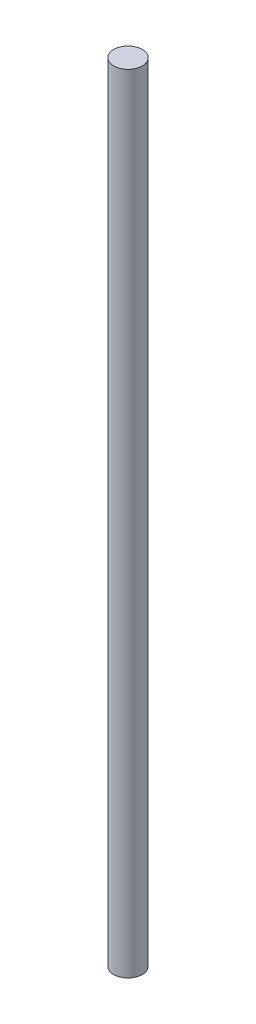
ISO-10303-21;
HEADER;
FILE_DESCRIPTION(('STEP AP214'),'2;1');
FILE_NAME('part.step','',(''),(''),'','','');
FILE_SCHEMA(('AUTOMOTIVE_DESIGN { 1 0 10303 214 1 1 1 1 }'));
ENDSEC;
DATA;
#1=APPLICATION_CONTEXT('core data for automotive mechanical design processes');
#2=APPLICATION_PROTOCOL_DEFINITION('international standard','automotive_design',2000,#1);
#3=PRODUCT_CONTEXT('',#1,'mechanical');
#4=PRODUCT('Part','Part','',(#3));
#5=PRODUCT_RELATED_PRODUCT_CATEGORY('part','',(#4));
#6=PRODUCT_DEFINITION_FORMATION('','',#4);
#7=PRODUCT_DEFINITION_CONTEXT('part definition',#1,'design');
#8=PRODUCT_DEFINITION('design','',#6,#7);
#9=PRODUCT_DEFINITION_SHAPE('','',#8);
#10=(LENGTH_UNIT() NAMED_UNIT(*) SI_UNIT(.MILLI.,.METRE.));
#11=(NAMED_UNIT(*) PLANE_ANGLE_UNIT() SI_UNIT($,.RADIAN.));
#12=(NAMED_UNIT(*) SI_UNIT($,.STERADIAN.) SOLID_ANGLE_UNIT());
#13=UNCERTAINTY_MEASURE_WITH_UNIT(LENGTH_MEASURE(1.E-05),#10,'distance_accuracy_value','');
#14=(GEOMETRIC_REPRESENTATION_CONTEXT(3) GLOBAL_UNCERTAINTY_ASSIGNED_CONTEXT((#13)) GLOBAL_UNIT_ASSIGNED_CONTEXT((#10,
#11,#12)) REPRESENTATION_CONTEXT('',''));
#15=CARTESIAN_POINT('',(0.,0.,0.));
#16=DIRECTION('',(0.,0.,1.));
#17=DIRECTION('',(1.,0.,0.));
#18=AXIS2_PLACEMENT_3D('',#15,#16,#17);
#19=CARTESIAN_POINT('',(0.,220.,0.));
#20=DIRECTION('',(0.,-1.,0.));
#21=DIRECTION('',(0.,0.,-1.));
#22=AXIS2_PLACEMENT_3D('',#19,#20,#21);
#23=CYLINDRICAL_SURFACE('',#22,4.);
#24=CARTESIAN_POINT('',(0.,220.,0.));
#25=DIRECTION('',(0.,1.,0.));
#26=DIRECTION('',(0.,0.,1.));
#27=AXIS2_PLACEMENT_3D('',#24,#25,#26);
#28=CIRCLE('',#27,4.);
#29=CARTESIAN_POINT('',(0.,220.,4.));
#30=VERTEX_POINT('',#29);
#31=EDGE_CURVE('E10',#30,#30,#28,.T.);
#32=ORIENTED_EDGE('',*,*,#31,.F.);
#33=EDGE_LOOP('',(#32));
#34=FACE_BOUND('',#33,.T.);
#35=CARTESIAN_POINT('',(0.,0.,0.));
#36=DIRECTION('',(0.,1.,0.));
#37=DIRECTION('',(0.,0.,1.));
#38=AXIS2_PLACEMENT_3D('',#35,#36,#37);
#39=CIRCLE('',#38,4.);
#40=CARTESIAN_POINT('',(0.,0.,4.));
#41=VERTEX_POINT('',#40);
#42=EDGE_CURVE('E33',#41,#41,#39,.T.);
#43=ORIENTED_EDGE('',*,*,#42,.T.);
#44=EDGE_LOOP('',(#43));
#45=FACE_BOUND('',#44,.T.);
#46=ADVANCED_FACE('F30',(#34,#45),#23,.T.);
#47=CARTESIAN_POINT('',(0.,220.,0.));
#48=DIRECTION('',(0.,1.,0.));
#49=DIRECTION('',(0.,0.,1.));
#50=AXIS2_PLACEMENT_3D('',#47,#48,#49);
#51=PLANE('',#50);
#52=ORIENTED_EDGE('',*,*,#31,.T.);
#53=EDGE_LOOP('',(#52));
#54=FACE_BOUND('',#53,.T.);
#55=ADVANCED_FACE('F45',(#54),#51,.T.);
#56=CARTESIAN_POINT('',(0.,0.,0.));
#57=DIRECTION('',(0.,1.,0.));
#58=DIRECTION('',(0.,0.,1.));
#59=AXIS2_PLACEMENT_3D('',#56,#57,#58);
#60=PLANE('',#59);
#61=ORIENTED_EDGE('',*,*,#42,.F.);
#62=EDGE_LOOP('',(#61));
#63=FACE_BOUND('',#62,.T.);
#64=ADVANCED_FACE('F43',(#63),#60,.F.);
#65=CLOSED_SHELL('',(#46,#55,#64));
#66=MANIFOLD_SOLID_BREP('B2',#65);
#67=ADVANCED_BREP_SHAPE_REPRESENTATION('',(#18,#66),#14);
#68=SHAPE_DEFINITION_REPRESENTATION(#9,#67);
ENDSEC;
END-ISO-10303-21;
